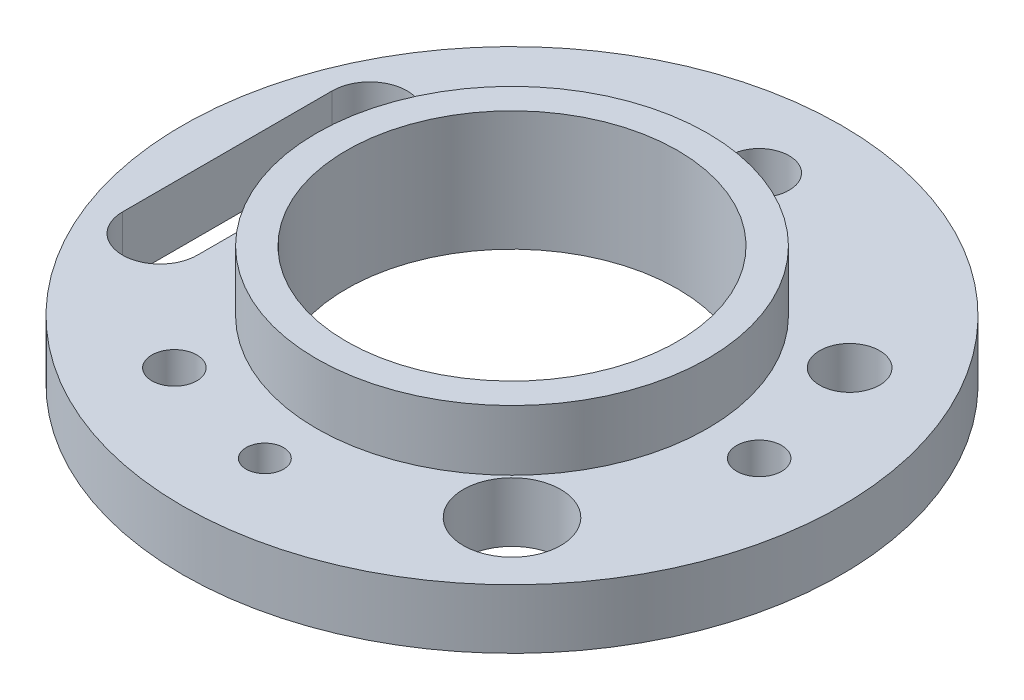
ISO-10303-21;
HEADER;
FILE_DESCRIPTION(('STEP AP214'),'2;1');
FILE_NAME('part.step','',(''),(''),'','','');
FILE_SCHEMA(('AUTOMOTIVE_DESIGN { 1 0 10303 214 1 1 1 1 }'));
ENDSEC;
DATA;
#1=APPLICATION_CONTEXT('core data for automotive mechanical design processes');
#2=APPLICATION_PROTOCOL_DEFINITION('international standard','automotive_design',2000,#1);
#3=PRODUCT_CONTEXT('',#1,'mechanical');
#4=PRODUCT('Part','Part','',(#3));
#5=PRODUCT_RELATED_PRODUCT_CATEGORY('part','',(#4));
#6=PRODUCT_DEFINITION_FORMATION('','',#4);
#7=PRODUCT_DEFINITION_CONTEXT('part definition',#1,'design');
#8=PRODUCT_DEFINITION('design','',#6,#7);
#9=PRODUCT_DEFINITION_SHAPE('','',#8);
#10=(LENGTH_UNIT() NAMED_UNIT(*) SI_UNIT(.MILLI.,.METRE.));
#11=(NAMED_UNIT(*) PLANE_ANGLE_UNIT() SI_UNIT($,.RADIAN.));
#12=(NAMED_UNIT(*) SI_UNIT($,.STERADIAN.) SOLID_ANGLE_UNIT());
#13=UNCERTAINTY_MEASURE_WITH_UNIT(LENGTH_MEASURE(1.E-05),#10,'distance_accuracy_value','');
#14=(GEOMETRIC_REPRESENTATION_CONTEXT(3) GLOBAL_UNCERTAINTY_ASSIGNED_CONTEXT((#13)) GLOBAL_UNIT_ASSIGNED_CONTEXT((#10,
#11,#12)) REPRESENTATION_CONTEXT('',''));
#15=CARTESIAN_POINT('',(0.,0.,0.));
#16=DIRECTION('',(0.,0.,1.));
#17=DIRECTION('',(1.,0.,0.));
#18=AXIS2_PLACEMENT_3D('',#15,#16,#17);
#19=CARTESIAN_POINT('',(22.,0.,0.));
#20=DIRECTION('',(0.,-1.,0.));
#21=DIRECTION('',(0.,0.,-1.));
#22=AXIS2_PLACEMENT_3D('',#19,#20,#21);
#23=PLANE('',#22);
#24=CARTESIAN_POINT('',(0.,0.,-16.5));
#25=DIRECTION('',(0.,1.,0.));
#26=DIRECTION('',(0.,0.,1.));
#27=AXIS2_PLACEMENT_3D('',#24,#25,#26);
#28=CIRCLE('',#27,2.);
#29=CARTESIAN_POINT('',(0.,0.,-14.5));
#30=VERTEX_POINT('',#29);
#31=EDGE_CURVE('E155',#30,#30,#28,.T.);
#32=ORIENTED_EDGE('',*,*,#31,.T.);
#33=EDGE_LOOP('',(#32));
#34=FACE_BOUND('',#33,.T.);
#35=CARTESIAN_POINT('',(11.667261889578,0.,11.6672618895781));
#36=DIRECTION('',(0.,1.,0.));
#37=DIRECTION('',(0.,0.,1.));
#38=AXIS2_PLACEMENT_3D('',#35,#36,#37);
#39=CIRCLE('',#38,3.25);
#40=CARTESIAN_POINT('',(11.667261889578,0.,14.9172618895781));
#41=VERTEX_POINT('',#40);
#42=EDGE_CURVE('E97',#41,#41,#39,.T.);
#43=ORIENTED_EDGE('',*,*,#42,.T.);
#44=EDGE_LOOP('',(#43));
#45=FACE_BOUND('',#44,.T.);
#46=CARTESIAN_POINT('',(-8.25,0.,-14.2894191624432));
#47=DIRECTION('',(0.,1.,0.));
#48=DIRECTION('',(0.,0.,1.));
#49=AXIS2_PLACEMENT_3D('',#46,#47,#48);
#50=CIRCLE('',#49,1.5);
#51=CARTESIAN_POINT('',(-8.25,0.,-12.7894191624432));
#52=VERTEX_POINT('',#51);
#53=EDGE_CURVE('E79',#52,#52,#50,.T.);
#54=ORIENTED_EDGE('',*,*,#53,.T.);
#55=EDGE_LOOP('',(#54));
#56=FACE_BOUND('',#55,.T.);
#57=CARTESIAN_POINT('',(16.5,0.,0.));
#58=DIRECTION('',(0.,1.,0.));
#59=DIRECTION('',(0.,0.,1.));
#60=AXIS2_PLACEMENT_3D('',#57,#58,#59);
#61=CIRCLE('',#60,1.5);
#62=CARTESIAN_POINT('',(16.5,0.,1.5));
#63=VERTEX_POINT('',#62);
#64=EDGE_CURVE('E115',#63,#63,#61,.T.);
#65=ORIENTED_EDGE('',*,*,#64,.T.);
#66=EDGE_LOOP('',(#65));
#67=FACE_BOUND('',#66,.T.);
#68=CARTESIAN_POINT('',(0.,0.,0.));
#69=DIRECTION('',(0.,-1.,0.));
#70=DIRECTION('',(0.,0.,-1.));
#71=AXIS2_PLACEMENT_3D('',#68,#69,#70);
#72=CIRCLE('',#71,22.);
#73=CARTESIAN_POINT('',(0.,0.,-22.));
#74=VERTEX_POINT('',#73);
#75=EDGE_CURVE('E119',#74,#74,#72,.T.);
#76=ORIENTED_EDGE('',*,*,#75,.T.);
#77=EDGE_LOOP('',(#76));
#78=FACE_BOUND('',#77,.T.);
#79=CARTESIAN_POINT('',(0.,0.,0.));
#80=DIRECTION('',(0.,-1.,0.));
#81=DIRECTION('',(0.,0.,-1.));
#82=AXIS2_PLACEMENT_3D('',#79,#80,#81);
#83=CIRCLE('',#82,11.05);
#84=CARTESIAN_POINT('',(0.,0.,-11.05));
#85=VERTEX_POINT('',#84);
#86=EDGE_CURVE('E134',#85,#85,#83,.T.);
#87=ORIENTED_EDGE('',*,*,#86,.F.);
#88=EDGE_LOOP('',(#87));
#89=FACE_BOUND('',#88,.T.);
#90=CARTESIAN_POINT('',(-8.24999999999999,0.,14.2894191624432));
#91=DIRECTION('',(0.,1.,0.));
#92=DIRECTION('',(0.,0.,1.));
#93=AXIS2_PLACEMENT_3D('',#90,#91,#92);
#94=CIRCLE('',#93,1.5);
#95=CARTESIAN_POINT('',(-8.24999999999999,0.,15.7894191624432));
#96=VERTEX_POINT('',#95);
#97=EDGE_CURVE('E111',#96,#96,#94,.T.);
#98=ORIENTED_EDGE('',*,*,#97,.T.);
#99=EDGE_LOOP('',(#98));
#100=FACE_BOUND('',#99,.T.);
#101=DIRECTION('',(0.,0.,-1.));
#102=VECTOR('',#101,1.);
#103=CARTESIAN_POINT('',(-14.,0.,7.));
#104=LINE('',#103,#102);
#105=CARTESIAN_POINT('',(-14.,0.,7.));
#106=VERTEX_POINT('',#105);
#107=CARTESIAN_POINT('',(-14.,0.,-7.));
#108=VERTEX_POINT('',#107);
#109=EDGE_CURVE('E93',#106,#108,#104,.T.);
#110=ORIENTED_EDGE('',*,*,#109,.T.);
#111=CARTESIAN_POINT('',(-16.5,0.,-7.));
#112=DIRECTION('',(0.,1.,0.));
#113=DIRECTION('',(0.,0.,1.));
#114=AXIS2_PLACEMENT_3D('',#111,#112,#113);
#115=CIRCLE('',#114,2.5);
#116=CARTESIAN_POINT('',(-19.,0.,-7.));
#117=VERTEX_POINT('',#116);
#118=EDGE_CURVE('E49',#108,#117,#115,.T.);
#119=ORIENTED_EDGE('',*,*,#118,.T.);
#120=DIRECTION('',(0.,0.,1.));
#121=VECTOR('',#120,1.);
#122=CARTESIAN_POINT('',(-19.,0.,-7.));
#123=LINE('',#122,#121);
#124=CARTESIAN_POINT('',(-19.,0.,7.));
#125=VERTEX_POINT('',#124);
#126=EDGE_CURVE('E83',#117,#125,#123,.T.);
#127=ORIENTED_EDGE('',*,*,#126,.T.);
#128=CARTESIAN_POINT('',(-16.5,0.,7.));
#129=DIRECTION('',(0.,1.,0.));
#130=DIRECTION('',(0.,0.,-1.));
#131=AXIS2_PLACEMENT_3D('',#128,#129,#130);
#132=CIRCLE('',#131,2.5);
#133=EDGE_CURVE('E89',#125,#106,#132,.T.);
#134=ORIENTED_EDGE('',*,*,#133,.T.);
#135=EDGE_LOOP('',(#110,#119,#127,#134));
#136=FACE_BOUND('',#135,.T.);
#137=CARTESIAN_POINT('',(14.2894191624432,0.,-8.25000000000002));
#138=DIRECTION('',(0.,1.,0.));
#139=DIRECTION('',(0.,0.,1.));
#140=AXIS2_PLACEMENT_3D('',#137,#138,#139);
#141=CIRCLE('',#140,2.00000000000001);
#142=CARTESIAN_POINT('',(14.2894191624432,0.,-6.25000000000001));
#143=VERTEX_POINT('',#142);
#144=EDGE_CURVE('E152',#143,#143,#141,.T.);
#145=ORIENTED_EDGE('',*,*,#144,.T.);
#146=EDGE_LOOP('',(#145));
#147=FACE_BOUND('',#146,.T.);
#148=CARTESIAN_POINT('',(0.,0.,16.5));
#149=DIRECTION('',(0.,1.,0.));
#150=DIRECTION('',(0.,0.,1.));
#151=AXIS2_PLACEMENT_3D('',#148,#149,#150);
#152=CIRCLE('',#151,1.25);
#153=CARTESIAN_POINT('',(0.,0.,17.75));
#154=VERTEX_POINT('',#153);
#155=EDGE_CURVE('E164',#154,#154,#152,.T.);
#156=ORIENTED_EDGE('',*,*,#155,.T.);
#157=EDGE_LOOP('',(#156));
#158=FACE_BOUND('',#157,.T.);
#159=ADVANCED_FACE('F33',(#34,#45,#56,#67,#78,#89,#100,#136,#147,#158),#23,.T.);
#160=CARTESIAN_POINT('',(13.05,3.96925539191489,0.));
#161=DIRECTION('',(0.,1.,0.));
#162=DIRECTION('',(0.,0.,1.));
#163=AXIS2_PLACEMENT_3D('',#160,#161,#162);
#164=PLANE('',#163);
#165=CARTESIAN_POINT('',(0.,3.96925539191489,-16.5));
#166=DIRECTION('',(0.,1.,0.));
#167=DIRECTION('',(0.,0.,1.));
#168=AXIS2_PLACEMENT_3D('',#165,#166,#167);
#169=CIRCLE('',#168,2.);
#170=CARTESIAN_POINT('',(0.,3.96925539191489,-14.5));
#171=VERTEX_POINT('',#170);
#172=EDGE_CURVE('E153',#171,#171,#169,.F.);
#173=ORIENTED_EDGE('',*,*,#172,.T.);
#174=EDGE_LOOP('',(#173));
#175=FACE_BOUND('',#174,.T.);
#176=CARTESIAN_POINT('',(11.667261889578,3.96925539191489,11.6672618895781));
#177=DIRECTION('',(0.,1.,0.));
#178=DIRECTION('',(0.,0.,1.));
#179=AXIS2_PLACEMENT_3D('',#176,#177,#178);
#180=CIRCLE('',#179,3.25);
#181=CARTESIAN_POINT('',(11.667261889578,3.96925539191489,14.9172618895781));
#182=VERTEX_POINT('',#181);
#183=EDGE_CURVE('E94',#182,#182,#180,.F.);
#184=ORIENTED_EDGE('',*,*,#183,.T.);
#185=EDGE_LOOP('',(#184));
#186=FACE_BOUND('',#185,.T.);
#187=CARTESIAN_POINT('',(-8.25,3.96925539191489,-14.2894191624432));
#188=DIRECTION('',(0.,1.,0.));
#189=DIRECTION('',(0.,0.,1.));
#190=AXIS2_PLACEMENT_3D('',#187,#188,#189);
#191=CIRCLE('',#190,1.5);
#192=CARTESIAN_POINT('',(-8.25,3.96925539191489,-12.7894191624432));
#193=VERTEX_POINT('',#192);
#194=EDGE_CURVE('E110',#193,#193,#191,.F.);
#195=ORIENTED_EDGE('',*,*,#194,.T.);
#196=EDGE_LOOP('',(#195));
#197=FACE_BOUND('',#196,.T.);
#198=CARTESIAN_POINT('',(16.5,3.96925539191489,0.));
#199=DIRECTION('',(0.,1.,0.));
#200=DIRECTION('',(0.,0.,1.));
#201=AXIS2_PLACEMENT_3D('',#198,#199,#200);
#202=CIRCLE('',#201,1.5);
#203=CARTESIAN_POINT('',(16.5,3.96925539191489,1.5));
#204=VERTEX_POINT('',#203);
#205=EDGE_CURVE('E118',#204,#204,#202,.F.);
#206=ORIENTED_EDGE('',*,*,#205,.T.);
#207=EDGE_LOOP('',(#206));
#208=FACE_BOUND('',#207,.T.);
#209=CARTESIAN_POINT('',(0.,3.96925539191489,0.));
#210=DIRECTION('',(0.,-1.,0.));
#211=DIRECTION('',(0.,0.,-1.));
#212=AXIS2_PLACEMENT_3D('',#209,#210,#211);
#213=CIRCLE('',#212,13.05);
#214=CARTESIAN_POINT('',(0.,3.96925539191489,-13.05));
#215=VERTEX_POINT('',#214);
#216=EDGE_CURVE('E125',#215,#215,#213,.T.);
#217=ORIENTED_EDGE('',*,*,#216,.T.);
#218=EDGE_LOOP('',(#217));
#219=FACE_BOUND('',#218,.T.);
#220=CARTESIAN_POINT('',(0.,3.96925539191489,0.));
#221=DIRECTION('',(0.,-1.,0.));
#222=DIRECTION('',(0.,0.,-1.));
#223=AXIS2_PLACEMENT_3D('',#220,#221,#222);
#224=CIRCLE('',#223,22.);
#225=CARTESIAN_POINT('',(0.,3.96925539191489,-22.));
#226=VERTEX_POINT('',#225);
#227=EDGE_CURVE('E122',#226,#226,#224,.T.);
#228=ORIENTED_EDGE('',*,*,#227,.F.);
#229=EDGE_LOOP('',(#228));
#230=FACE_BOUND('',#229,.T.);
#231=CARTESIAN_POINT('',(-8.24999999999999,3.96925539191489,14.2894191624432));
#232=DIRECTION('',(0.,1.,0.));
#233=DIRECTION('',(0.,0.,1.));
#234=AXIS2_PLACEMENT_3D('',#231,#232,#233);
#235=CIRCLE('',#234,1.5);
#236=CARTESIAN_POINT('',(-8.24999999999999,3.96925539191489,15.7894191624432));
#237=VERTEX_POINT('',#236);
#238=EDGE_CURVE('E114',#237,#237,#235,.F.);
#239=ORIENTED_EDGE('',*,*,#238,.T.);
#240=EDGE_LOOP('',(#239));
#241=FACE_BOUND('',#240,.T.);
#242=DIRECTION('',(0.,0.,-1.));
#243=VECTOR('',#242,1.);
#244=CARTESIAN_POINT('',(-19.,3.96925539191489,0.));
#245=LINE('',#244,#243);
#246=CARTESIAN_POINT('',(-19.,3.96925539191489,7.));
#247=VERTEX_POINT('',#246);
#248=CARTESIAN_POINT('',(-19.,3.96925539191489,-7.));
#249=VERTEX_POINT('',#248);
#250=EDGE_CURVE('E41',#247,#249,#245,.T.);
#251=ORIENTED_EDGE('',*,*,#250,.T.);
#252=CARTESIAN_POINT('',(-16.5,3.96925539191489,-7.));
#253=DIRECTION('',(0.,1.,0.));
#254=DIRECTION('',(0.,0.,1.));
#255=AXIS2_PLACEMENT_3D('',#252,#253,#254);
#256=CIRCLE('',#255,2.5);
#257=CARTESIAN_POINT('',(-14.,3.96925539191489,-7.));
#258=VERTEX_POINT('',#257);
#259=EDGE_CURVE('E11',#249,#258,#256,.F.);
#260=ORIENTED_EDGE('',*,*,#259,.T.);
#261=DIRECTION('',(0.,0.,1.));
#262=VECTOR('',#261,1.);
#263=CARTESIAN_POINT('',(-14.,3.96925539191489,0.));
#264=LINE('',#263,#262);
#265=CARTESIAN_POINT('',(-14.,3.96925539191489,7.));
#266=VERTEX_POINT('',#265);
#267=EDGE_CURVE('E137',#258,#266,#264,.T.);
#268=ORIENTED_EDGE('',*,*,#267,.T.);
#269=CARTESIAN_POINT('',(-16.5,3.96925539191489,7.));
#270=DIRECTION('',(0.,1.,0.));
#271=DIRECTION('',(0.,0.,1.));
#272=AXIS2_PLACEMENT_3D('',#269,#270,#271);
#273=CIRCLE('',#272,2.5);
#274=EDGE_CURVE('E146',#266,#247,#273,.F.);
#275=ORIENTED_EDGE('',*,*,#274,.T.);
#276=EDGE_LOOP('',(#251,#260,#268,#275));
#277=FACE_BOUND('',#276,.T.);
#278=CARTESIAN_POINT('',(14.2894191624432,3.96925539191489,-8.25000000000002));
#279=DIRECTION('',(0.,1.,0.));
#280=DIRECTION('',(0.,0.,1.));
#281=AXIS2_PLACEMENT_3D('',#278,#279,#280);
#282=CIRCLE('',#281,2.00000000000001);
#283=CARTESIAN_POINT('',(14.2894191624432,3.96925539191489,-6.25000000000001));
#284=VERTEX_POINT('',#283);
#285=EDGE_CURVE('E150',#284,#284,#282,.F.);
#286=ORIENTED_EDGE('',*,*,#285,.T.);
#287=EDGE_LOOP('',(#286));
#288=FACE_BOUND('',#287,.T.);
#289=CARTESIAN_POINT('',(0.,3.96925539191489,16.5));
#290=DIRECTION('',(0.,1.,0.));
#291=DIRECTION('',(0.,0.,1.));
#292=AXIS2_PLACEMENT_3D('',#289,#290,#291);
#293=CIRCLE('',#292,1.25);
#294=CARTESIAN_POINT('',(0.,3.96925539191489,17.75));
#295=VERTEX_POINT('',#294);
#296=EDGE_CURVE('E36',#295,#295,#293,.F.);
#297=ORIENTED_EDGE('',*,*,#296,.T.);
#298=EDGE_LOOP('',(#297));
#299=FACE_BOUND('',#298,.T.);
#300=ADVANCED_FACE('F183',(#175,#186,#197,#208,#219,#230,#241,#277,#288,#299),#164,.T.);
#301=CARTESIAN_POINT('',(0.,0.,0.));
#302=DIRECTION('',(0.,-1.,0.));
#303=DIRECTION('',(0.,0.,-1.));
#304=AXIS2_PLACEMENT_3D('',#301,#302,#303);
#305=CYLINDRICAL_SURFACE('',#304,11.05);
#306=ORIENTED_EDGE('',*,*,#86,.T.);
#307=EDGE_LOOP('',(#306));
#308=FACE_BOUND('',#307,.T.);
#309=CARTESIAN_POINT('',(0.,8.,0.));
#310=DIRECTION('',(0.,-1.,0.));
#311=DIRECTION('',(0.,0.,-1.));
#312=AXIS2_PLACEMENT_3D('',#309,#310,#311);
#313=CIRCLE('',#312,11.05);
#314=CARTESIAN_POINT('',(0.,8.,-11.05));
#315=VERTEX_POINT('',#314);
#316=EDGE_CURVE('E131',#315,#315,#313,.T.);
#317=ORIENTED_EDGE('',*,*,#316,.F.);
#318=EDGE_LOOP('',(#317));
#319=FACE_BOUND('',#318,.T.);
#320=ADVANCED_FACE('F187',(#308,#319),#305,.F.);
#321=CARTESIAN_POINT('',(11.05,8.,0.));
#322=DIRECTION('',(0.,1.,0.));
#323=DIRECTION('',(0.,0.,1.));
#324=AXIS2_PLACEMENT_3D('',#321,#322,#323);
#325=PLANE('',#324);
#326=ORIENTED_EDGE('',*,*,#316,.T.);
#327=EDGE_LOOP('',(#326));
#328=FACE_BOUND('',#327,.T.);
#329=CARTESIAN_POINT('',(0.,8.,0.));
#330=DIRECTION('',(0.,-1.,0.));
#331=DIRECTION('',(0.,0.,-1.));
#332=AXIS2_PLACEMENT_3D('',#329,#330,#331);
#333=CIRCLE('',#332,13.05);
#334=CARTESIAN_POINT('',(0.,8.,-13.05));
#335=VERTEX_POINT('',#334);
#336=EDGE_CURVE('E128',#335,#335,#333,.T.);
#337=ORIENTED_EDGE('',*,*,#336,.F.);
#338=EDGE_LOOP('',(#337));
#339=FACE_BOUND('',#338,.T.);
#340=ADVANCED_FACE('F227',(#328,#339),#325,.T.);
#341=CARTESIAN_POINT('',(0.,0.,0.));
#342=DIRECTION('',(0.,-1.,0.));
#343=DIRECTION('',(0.,0.,-1.));
#344=AXIS2_PLACEMENT_3D('',#341,#342,#343);
#345=CYLINDRICAL_SURFACE('',#344,13.05);
#346=ORIENTED_EDGE('',*,*,#336,.T.);
#347=EDGE_LOOP('',(#346));
#348=FACE_BOUND('',#347,.T.);
#349=ORIENTED_EDGE('',*,*,#216,.F.);
#350=EDGE_LOOP('',(#349));
#351=FACE_BOUND('',#350,.T.);
#352=ADVANCED_FACE('F222',(#348,#351),#345,.T.);
#353=CARTESIAN_POINT('',(0.,0.,0.));
#354=DIRECTION('',(0.,-1.,0.));
#355=DIRECTION('',(0.,0.,-1.));
#356=AXIS2_PLACEMENT_3D('',#353,#354,#355);
#357=CYLINDRICAL_SURFACE('',#356,22.);
#358=ORIENTED_EDGE('',*,*,#227,.T.);
#359=EDGE_LOOP('',(#358));
#360=FACE_BOUND('',#359,.T.);
#361=ORIENTED_EDGE('',*,*,#75,.F.);
#362=EDGE_LOOP('',(#361));
#363=FACE_BOUND('',#362,.T.);
#364=ADVANCED_FACE('F215',(#360,#363),#357,.T.);
#365=CARTESIAN_POINT('',(16.5,10.,0.));
#366=DIRECTION('',(0.,-1.,0.));
#367=DIRECTION('',(0.,0.,-1.));
#368=AXIS2_PLACEMENT_3D('',#365,#366,#367);
#369=CYLINDRICAL_SURFACE('',#368,1.5);
#370=ORIENTED_EDGE('',*,*,#205,.F.);
#371=EDGE_LOOP('',(#370));
#372=FACE_BOUND('',#371,.T.);
#373=ORIENTED_EDGE('',*,*,#64,.F.);
#374=EDGE_LOOP('',(#373));
#375=FACE_BOUND('',#374,.T.);
#376=ADVANCED_FACE('F206',(#372,#375),#369,.F.);
#377=CARTESIAN_POINT('',(-8.24999999999999,10.,14.2894191624432));
#378=DIRECTION('',(0.,-1.,0.));
#379=DIRECTION('',(0.,0.,-1.));
#380=AXIS2_PLACEMENT_3D('',#377,#378,#379);
#381=CYLINDRICAL_SURFACE('',#380,1.5);
#382=ORIENTED_EDGE('',*,*,#238,.F.);
#383=EDGE_LOOP('',(#382));
#384=FACE_BOUND('',#383,.T.);
#385=ORIENTED_EDGE('',*,*,#97,.F.);
#386=EDGE_LOOP('',(#385));
#387=FACE_BOUND('',#386,.T.);
#388=ADVANCED_FACE('F203',(#384,#387),#381,.F.);
#389=CARTESIAN_POINT('',(-8.25,10.,-14.2894191624432));
#390=DIRECTION('',(0.,-1.,0.));
#391=DIRECTION('',(0.,0.,-1.));
#392=AXIS2_PLACEMENT_3D('',#389,#390,#391);
#393=CYLINDRICAL_SURFACE('',#392,1.5);
#394=ORIENTED_EDGE('',*,*,#194,.F.);
#395=EDGE_LOOP('',(#394));
#396=FACE_BOUND('',#395,.T.);
#397=ORIENTED_EDGE('',*,*,#53,.F.);
#398=EDGE_LOOP('',(#397));
#399=FACE_BOUND('',#398,.T.);
#400=ADVANCED_FACE('F205',(#396,#399),#393,.F.);
#401=CARTESIAN_POINT('',(-16.5,10.,-7.));
#402=DIRECTION('',(0.,-1.,0.));
#403=DIRECTION('',(0.,0.,-1.));
#404=AXIS2_PLACEMENT_3D('',#401,#402,#403);
#405=CYLINDRICAL_SURFACE('',#404,2.5);
#406=DIRECTION('',(0.,-1.,0.));
#407=VECTOR('',#406,1.);
#408=CARTESIAN_POINT('',(-19.,10.,-7.));
#409=LINE('',#408,#407);
#410=EDGE_CURVE('E74',#249,#117,#409,.T.);
#411=ORIENTED_EDGE('',*,*,#410,.T.);
#412=ORIENTED_EDGE('',*,*,#118,.F.);
#413=DIRECTION('',(0.,-1.,0.));
#414=VECTOR('',#413,1.);
#415=CARTESIAN_POINT('',(-14.,10.,-7.));
#416=LINE('',#415,#414);
#417=EDGE_CURVE('E104',#258,#108,#416,.T.);
#418=ORIENTED_EDGE('',*,*,#417,.F.);
#419=ORIENTED_EDGE('',*,*,#259,.F.);
#420=EDGE_LOOP('',(#411,#412,#418,#419));
#421=FACE_BOUND('',#420,.T.);
#422=ADVANCED_FACE('F76',(#421),#405,.F.);
#423=CARTESIAN_POINT('',(-19.,10.,-7.));
#424=DIRECTION('',(1.,0.,0.));
#425=DIRECTION('',(0.,0.,-1.));
#426=AXIS2_PLACEMENT_3D('',#423,#424,#425);
#427=PLANE('',#426);
#428=DIRECTION('',(0.,-1.,0.));
#429=VECTOR('',#428,1.);
#430=CARTESIAN_POINT('',(-19.,10.,7.));
#431=LINE('',#430,#429);
#432=EDGE_CURVE('E80',#247,#125,#431,.T.);
#433=ORIENTED_EDGE('',*,*,#432,.T.);
#434=ORIENTED_EDGE('',*,*,#126,.F.);
#435=ORIENTED_EDGE('',*,*,#410,.F.);
#436=ORIENTED_EDGE('',*,*,#250,.F.);
#437=EDGE_LOOP('',(#433,#434,#435,#436));
#438=FACE_BOUND('',#437,.T.);
#439=ADVANCED_FACE('F84',(#438),#427,.T.);
#440=CARTESIAN_POINT('',(-16.5,10.,7.));
#441=DIRECTION('',(0.,-1.,0.));
#442=DIRECTION('',(0.,0.,-1.));
#443=AXIS2_PLACEMENT_3D('',#440,#441,#442);
#444=CYLINDRICAL_SURFACE('',#443,2.5);
#445=DIRECTION('',(0.,-1.,0.));
#446=VECTOR('',#445,1.);
#447=CARTESIAN_POINT('',(-14.,10.,7.));
#448=LINE('',#447,#446);
#449=EDGE_CURVE('E57',#266,#106,#448,.T.);
#450=ORIENTED_EDGE('',*,*,#449,.T.);
#451=ORIENTED_EDGE('',*,*,#133,.F.);
#452=ORIENTED_EDGE('',*,*,#432,.F.);
#453=ORIENTED_EDGE('',*,*,#274,.F.);
#454=EDGE_LOOP('',(#450,#451,#452,#453));
#455=FACE_BOUND('',#454,.T.);
#456=ADVANCED_FACE('F264',(#455),#444,.F.);
#457=CARTESIAN_POINT('',(-14.,10.,7.));
#458=DIRECTION('',(-1.,0.,0.));
#459=DIRECTION('',(0.,0.,1.));
#460=AXIS2_PLACEMENT_3D('',#457,#458,#459);
#461=PLANE('',#460);
#462=ORIENTED_EDGE('',*,*,#417,.T.);
#463=ORIENTED_EDGE('',*,*,#109,.F.);
#464=ORIENTED_EDGE('',*,*,#449,.F.);
#465=ORIENTED_EDGE('',*,*,#267,.F.);
#466=EDGE_LOOP('',(#462,#463,#464,#465));
#467=FACE_BOUND('',#466,.T.);
#468=ADVANCED_FACE('F258',(#467),#461,.T.);
#469=CARTESIAN_POINT('',(11.667261889578,10.,11.6672618895781));
#470=DIRECTION('',(0.,-1.,0.));
#471=DIRECTION('',(0.,0.,-1.));
#472=AXIS2_PLACEMENT_3D('',#469,#470,#471);
#473=CYLINDRICAL_SURFACE('',#472,3.25);
#474=ORIENTED_EDGE('',*,*,#183,.F.);
#475=EDGE_LOOP('',(#474));
#476=FACE_BOUND('',#475,.T.);
#477=ORIENTED_EDGE('',*,*,#42,.F.);
#478=EDGE_LOOP('',(#477));
#479=FACE_BOUND('',#478,.T.);
#480=ADVANCED_FACE('F252',(#476,#479),#473,.F.);
#481=CARTESIAN_POINT('',(14.2894191624432,10.,-8.25000000000002));
#482=DIRECTION('',(0.,-1.,0.));
#483=DIRECTION('',(0.,0.,-1.));
#484=AXIS2_PLACEMENT_3D('',#481,#482,#483);
#485=CYLINDRICAL_SURFACE('',#484,2.00000000000001);
#486=ORIENTED_EDGE('',*,*,#285,.F.);
#487=EDGE_LOOP('',(#486));
#488=FACE_BOUND('',#487,.T.);
#489=ORIENTED_EDGE('',*,*,#144,.F.);
#490=EDGE_LOOP('',(#489));
#491=FACE_BOUND('',#490,.T.);
#492=ADVANCED_FACE('F178',(#488,#491),#485,.F.);
#493=CARTESIAN_POINT('',(0.,10.,-16.5));
#494=DIRECTION('',(0.,-1.,0.));
#495=DIRECTION('',(0.,0.,-1.));
#496=AXIS2_PLACEMENT_3D('',#493,#494,#495);
#497=CYLINDRICAL_SURFACE('',#496,2.);
#498=ORIENTED_EDGE('',*,*,#172,.F.);
#499=EDGE_LOOP('',(#498));
#500=FACE_BOUND('',#499,.T.);
#501=ORIENTED_EDGE('',*,*,#31,.F.);
#502=EDGE_LOOP('',(#501));
#503=FACE_BOUND('',#502,.T.);
#504=ADVANCED_FACE('F172',(#500,#503),#497,.F.);
#505=CARTESIAN_POINT('',(0.,10.,16.5));
#506=DIRECTION('',(0.,-1.,0.));
#507=DIRECTION('',(0.,0.,-1.));
#508=AXIS2_PLACEMENT_3D('',#505,#506,#507);
#509=CYLINDRICAL_SURFACE('',#508,1.25);
#510=ORIENTED_EDGE('',*,*,#296,.F.);
#511=EDGE_LOOP('',(#510));
#512=FACE_BOUND('',#511,.T.);
#513=ORIENTED_EDGE('',*,*,#155,.F.);
#514=EDGE_LOOP('',(#513));
#515=FACE_BOUND('',#514,.T.);
#516=ADVANCED_FACE('F170',(#512,#515),#509,.F.);
#517=CLOSED_SHELL('',(#159,#300,#320,#340,#352,#364,#376,#388,#400,#422,#439,#456,#468,#480,
#492,#504,#516));
#518=MANIFOLD_SOLID_BREP('B2',#517);
#519=ADVANCED_BREP_SHAPE_REPRESENTATION('',(#18,#518),#14);
#520=SHAPE_DEFINITION_REPRESENTATION(#9,#519);
ENDSEC;
END-ISO-10303-21;
